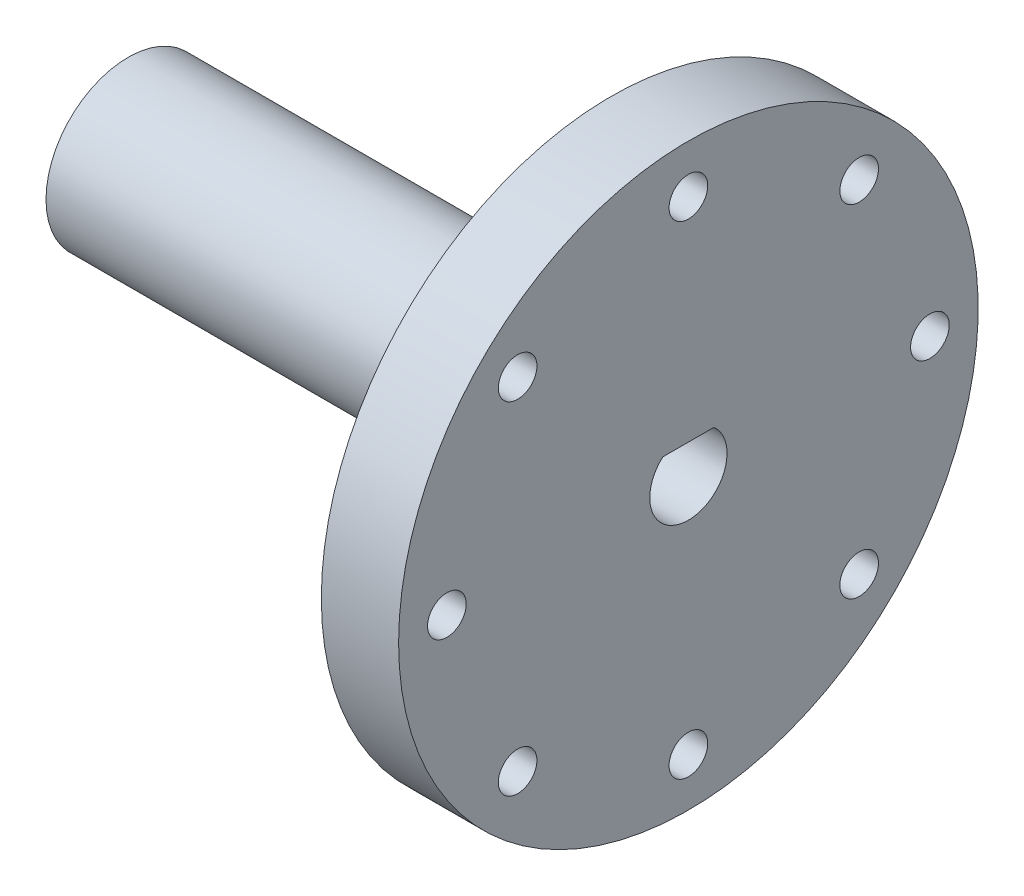
ISO-10303-21;
HEADER;
FILE_DESCRIPTION(('STEP AP214'),'2;1');
FILE_NAME('part.step','',(''),(''),'','','');
FILE_SCHEMA(('AUTOMOTIVE_DESIGN { 1 0 10303 214 1 1 1 1 }'));
ENDSEC;
DATA;
#1=APPLICATION_CONTEXT('core data for automotive mechanical design processes');
#2=APPLICATION_PROTOCOL_DEFINITION('international standard','automotive_design',2000,#1);
#3=PRODUCT_CONTEXT('',#1,'mechanical');
#4=PRODUCT('Part','Part','',(#3));
#5=PRODUCT_RELATED_PRODUCT_CATEGORY('part','',(#4));
#6=PRODUCT_DEFINITION_FORMATION('','',#4);
#7=PRODUCT_DEFINITION_CONTEXT('part definition',#1,'design');
#8=PRODUCT_DEFINITION('design','',#6,#7);
#9=PRODUCT_DEFINITION_SHAPE('','',#8);
#10=(LENGTH_UNIT() NAMED_UNIT(*) SI_UNIT(.MILLI.,.METRE.));
#11=(NAMED_UNIT(*) PLANE_ANGLE_UNIT() SI_UNIT($,.RADIAN.));
#12=(NAMED_UNIT(*) SI_UNIT($,.STERADIAN.) SOLID_ANGLE_UNIT());
#13=UNCERTAINTY_MEASURE_WITH_UNIT(LENGTH_MEASURE(1.E-05),#10,'distance_accuracy_value','');
#14=(GEOMETRIC_REPRESENTATION_CONTEXT(3) GLOBAL_UNCERTAINTY_ASSIGNED_CONTEXT((#13)) GLOBAL_UNIT_ASSIGNED_CONTEXT((#10,
#11,#12)) REPRESENTATION_CONTEXT('',''));
#15=CARTESIAN_POINT('',(0.,0.,0.));
#16=DIRECTION('',(0.,0.,1.));
#17=DIRECTION('',(1.,0.,0.));
#18=AXIS2_PLACEMENT_3D('',#15,#16,#17);
#19=CARTESIAN_POINT('',(0.,8.5,0.));
#20=DIRECTION('',(1.,0.,0.));
#21=DIRECTION('',(0.,0.,-1.));
#22=AXIS2_PLACEMENT_3D('',#19,#20,#21);
#23=PLANE('',#22);
#24=CARTESIAN_POINT('',(0.,0.,0.));
#25=DIRECTION('',(-1.,0.,0.));
#26=DIRECTION('',(0.,0.,1.));
#27=AXIS2_PLACEMENT_3D('',#24,#25,#26);
#28=CIRCLE('',#27,4.);
#29=CARTESIAN_POINT('',(0.,3.,-2.64575131106459));
#30=VERTEX_POINT('',#29);
#31=CARTESIAN_POINT('',(0.,3.,2.64575131106459));
#32=VERTEX_POINT('',#31);
#33=EDGE_CURVE('E51',#30,#32,#28,.T.);
#34=ORIENTED_EDGE('',*,*,#33,.F.);
#35=DIRECTION('',(0.,0.,1.));
#36=VECTOR('',#35,1.);
#37=CARTESIAN_POINT('',(0.,3.,-2.64575131106459));
#38=LINE('',#37,#36);
#39=EDGE_CURVE('E79',#30,#32,#38,.T.);
#40=ORIENTED_EDGE('',*,*,#39,.T.);
#41=EDGE_LOOP('',(#34,#40));
#42=FACE_BOUND('',#41,.T.);
#43=CARTESIAN_POINT('',(0.,0.,0.));
#44=DIRECTION('',(-1.,0.,0.));
#45=DIRECTION('',(0.,0.,1.));
#46=AXIS2_PLACEMENT_3D('',#43,#44,#45);
#47=CIRCLE('',#46,8.5);
#48=CARTESIAN_POINT('',(0.,0.,8.5));
#49=VERTEX_POINT('',#48);
#50=EDGE_CURVE('E98',#49,#49,#47,.T.);
#51=ORIENTED_EDGE('',*,*,#50,.T.);
#52=EDGE_LOOP('',(#51));
#53=FACE_BOUND('',#52,.T.);
#54=ADVANCED_FACE('F43',(#42,#53),#23,.F.);
#55=CARTESIAN_POINT('',(0.,0.,0.));
#56=DIRECTION('',(-1.,0.,0.));
#57=DIRECTION('',(0.,0.,1.));
#58=AXIS2_PLACEMENT_3D('',#55,#56,#57);
#59=CYLINDRICAL_SURFACE('',#58,4.);
#60=ORIENTED_EDGE('',*,*,#33,.T.);
#61=DIRECTION('',(-1.,0.,0.));
#62=VECTOR('',#61,1.);
#63=CARTESIAN_POINT('',(58.,3.,2.64575131106459));
#64=LINE('',#63,#62);
#65=CARTESIAN_POINT('',(58.,3.,2.64575131106459));
#66=VERTEX_POINT('',#65);
#67=EDGE_CURVE('E76',#66,#32,#64,.T.);
#68=ORIENTED_EDGE('',*,*,#67,.F.);
#69=CARTESIAN_POINT('',(58.,0.,0.));
#70=DIRECTION('',(-1.,0.,0.));
#71=DIRECTION('',(0.,0.,1.));
#72=AXIS2_PLACEMENT_3D('',#69,#70,#71);
#73=CIRCLE('',#72,4.);
#74=CARTESIAN_POINT('',(58.,3.,-2.64575131106459));
#75=VERTEX_POINT('',#74);
#76=EDGE_CURVE('E74',#75,#66,#73,.T.);
#77=ORIENTED_EDGE('',*,*,#76,.F.);
#78=DIRECTION('',(-1.,0.,0.));
#79=VECTOR('',#78,1.);
#80=CARTESIAN_POINT('',(58.,3.,-2.64575131106459));
#81=LINE('',#80,#79);
#82=EDGE_CURVE('E70',#75,#30,#81,.T.);
#83=ORIENTED_EDGE('',*,*,#82,.T.);
#84=EDGE_LOOP('',(#60,#68,#77,#83));
#85=FACE_BOUND('',#84,.T.);
#86=ADVANCED_FACE('F72',(#85),#59,.F.);
#87=CARTESIAN_POINT('',(58.,4.,0.));
#88=DIRECTION('',(-1.,0.,0.));
#89=DIRECTION('',(0.,0.,1.));
#90=AXIS2_PLACEMENT_3D('',#87,#88,#89);
#91=PLANE('',#90);
#92=CARTESIAN_POINT('',(58.,25.,0.));
#93=DIRECTION('',(-1.,0.,0.));
#94=DIRECTION('',(0.,0.,1.));
#95=AXIS2_PLACEMENT_3D('',#92,#93,#94);
#96=CIRCLE('',#95,2.);
#97=CARTESIAN_POINT('',(58.,25.,2.));
#98=VERTEX_POINT('',#97);
#99=EDGE_CURVE('E102',#98,#98,#96,.T.);
#100=ORIENTED_EDGE('',*,*,#99,.T.);
#101=EDGE_LOOP('',(#100));
#102=FACE_BOUND('',#101,.T.);
#103=CARTESIAN_POINT('',(58.,17.6776695296637,17.6776695296637));
#104=DIRECTION('',(-1.,0.,0.));
#105=DIRECTION('',(0.,0.,1.));
#106=AXIS2_PLACEMENT_3D('',#103,#104,#105);
#107=CIRCLE('',#106,2.00000000000001);
#108=CARTESIAN_POINT('',(58.,17.6776695296637,19.6776695296637));
#109=VERTEX_POINT('',#108);
#110=EDGE_CURVE('E106',#109,#109,#107,.T.);
#111=ORIENTED_EDGE('',*,*,#110,.T.);
#112=EDGE_LOOP('',(#111));
#113=FACE_BOUND('',#112,.T.);
#114=CARTESIAN_POINT('',(58.,0.,25.));
#115=DIRECTION('',(-1.,0.,0.));
#116=DIRECTION('',(0.,0.,1.));
#117=AXIS2_PLACEMENT_3D('',#114,#115,#116);
#118=CIRCLE('',#117,2.);
#119=CARTESIAN_POINT('',(58.,0.,27.));
#120=VERTEX_POINT('',#119);
#121=EDGE_CURVE('E110',#120,#120,#118,.T.);
#122=ORIENTED_EDGE('',*,*,#121,.T.);
#123=EDGE_LOOP('',(#122));
#124=FACE_BOUND('',#123,.T.);
#125=CARTESIAN_POINT('',(58.,-17.6776695296637,17.6776695296637));
#126=DIRECTION('',(-1.,0.,0.));
#127=DIRECTION('',(0.,0.,1.));
#128=AXIS2_PLACEMENT_3D('',#125,#126,#127);
#129=CIRCLE('',#128,2.);
#130=CARTESIAN_POINT('',(58.,-17.6776695296637,19.6776695296637));
#131=VERTEX_POINT('',#130);
#132=EDGE_CURVE('E114',#131,#131,#129,.T.);
#133=ORIENTED_EDGE('',*,*,#132,.T.);
#134=EDGE_LOOP('',(#133));
#135=FACE_BOUND('',#134,.T.);
#136=CARTESIAN_POINT('',(58.,-25.,0.));
#137=DIRECTION('',(-1.,0.,0.));
#138=DIRECTION('',(0.,0.,1.));
#139=AXIS2_PLACEMENT_3D('',#136,#137,#138);
#140=CIRCLE('',#139,2.);
#141=CARTESIAN_POINT('',(58.,-25.,2.));
#142=VERTEX_POINT('',#141);
#143=EDGE_CURVE('E118',#142,#142,#140,.T.);
#144=ORIENTED_EDGE('',*,*,#143,.T.);
#145=EDGE_LOOP('',(#144));
#146=FACE_BOUND('',#145,.T.);
#147=CARTESIAN_POINT('',(58.,-17.6776695296637,-17.6776695296637));
#148=DIRECTION('',(-1.,0.,0.));
#149=DIRECTION('',(0.,0.,1.));
#150=AXIS2_PLACEMENT_3D('',#147,#148,#149);
#151=CIRCLE('',#150,2.);
#152=CARTESIAN_POINT('',(58.,-17.6776695296637,-15.6776695296637));
#153=VERTEX_POINT('',#152);
#154=EDGE_CURVE('E122',#153,#153,#151,.T.);
#155=ORIENTED_EDGE('',*,*,#154,.T.);
#156=EDGE_LOOP('',(#155));
#157=FACE_BOUND('',#156,.T.);
#158=CARTESIAN_POINT('',(58.,0.,-25.));
#159=DIRECTION('',(-1.,0.,0.));
#160=DIRECTION('',(0.,0.,1.));
#161=AXIS2_PLACEMENT_3D('',#158,#159,#160);
#162=CIRCLE('',#161,2.);
#163=CARTESIAN_POINT('',(58.,0.,-23.));
#164=VERTEX_POINT('',#163);
#165=EDGE_CURVE('E126',#164,#164,#162,.T.);
#166=ORIENTED_EDGE('',*,*,#165,.T.);
#167=EDGE_LOOP('',(#166));
#168=FACE_BOUND('',#167,.T.);
#169=CARTESIAN_POINT('',(58.,17.6776695296637,-17.6776695296637));
#170=DIRECTION('',(-1.,0.,0.));
#171=DIRECTION('',(0.,0.,1.));
#172=AXIS2_PLACEMENT_3D('',#169,#170,#171);
#173=CIRCLE('',#172,2.);
#174=CARTESIAN_POINT('',(58.,17.6776695296637,-15.6776695296637));
#175=VERTEX_POINT('',#174);
#176=EDGE_CURVE('E130',#175,#175,#173,.T.);
#177=ORIENTED_EDGE('',*,*,#176,.T.);
#178=EDGE_LOOP('',(#177));
#179=FACE_BOUND('',#178,.T.);
#180=CARTESIAN_POINT('',(58.,0.,0.));
#181=DIRECTION('',(-1.,0.,0.));
#182=DIRECTION('',(0.,0.,1.));
#183=AXIS2_PLACEMENT_3D('',#180,#181,#182);
#184=CIRCLE('',#183,30.);
#185=CARTESIAN_POINT('',(58.,0.,30.));
#186=VERTEX_POINT('',#185);
#187=EDGE_CURVE('E88',#186,#186,#184,.T.);
#188=ORIENTED_EDGE('',*,*,#187,.F.);
#189=EDGE_LOOP('',(#188));
#190=FACE_BOUND('',#189,.T.);
#191=ORIENTED_EDGE('',*,*,#76,.T.);
#192=DIRECTION('',(0.,0.,1.));
#193=VECTOR('',#192,1.);
#194=CARTESIAN_POINT('',(58.,3.,-2.64575131106459));
#195=LINE('',#194,#193);
#196=EDGE_CURVE('E57',#75,#66,#195,.T.);
#197=ORIENTED_EDGE('',*,*,#196,.F.);
#198=EDGE_LOOP('',(#191,#197));
#199=FACE_BOUND('',#198,.T.);
#200=ADVANCED_FACE('F213',(#102,#113,#124,#135,#146,#157,#168,#179,#190,#199),#91,.F.);
#201=CARTESIAN_POINT('',(0.,0.,0.));
#202=DIRECTION('',(-1.,0.,0.));
#203=DIRECTION('',(0.,0.,1.));
#204=AXIS2_PLACEMENT_3D('',#201,#202,#203);
#205=CYLINDRICAL_SURFACE('',#204,30.);
#206=CARTESIAN_POINT('',(50.,0.,0.));
#207=DIRECTION('',(-1.,0.,0.));
#208=DIRECTION('',(0.,0.,1.));
#209=AXIS2_PLACEMENT_3D('',#206,#207,#208);
#210=CIRCLE('',#209,30.);
#211=CARTESIAN_POINT('',(50.,0.,30.));
#212=VERTEX_POINT('',#211);
#213=EDGE_CURVE('E94',#212,#212,#210,.T.);
#214=ORIENTED_EDGE('',*,*,#213,.F.);
#215=EDGE_LOOP('',(#214));
#216=FACE_BOUND('',#215,.T.);
#217=ORIENTED_EDGE('',*,*,#187,.T.);
#218=EDGE_LOOP('',(#217));
#219=FACE_BOUND('',#218,.T.);
#220=ADVANCED_FACE('F191',(#216,#219),#205,.T.);
#221=CARTESIAN_POINT('',(50.,30.,0.));
#222=DIRECTION('',(1.,0.,0.));
#223=DIRECTION('',(0.,0.,-1.));
#224=AXIS2_PLACEMENT_3D('',#221,#222,#223);
#225=PLANE('',#224);
#226=CARTESIAN_POINT('',(50.,0.,0.));
#227=DIRECTION('',(1.,0.,0.));
#228=DIRECTION('',(0.,0.,-1.));
#229=AXIS2_PLACEMENT_3D('',#226,#227,#228);
#230=CIRCLE('',#229,10.);
#231=CARTESIAN_POINT('',(50.,0.,-10.));
#232=VERTEX_POINT('',#231);
#233=EDGE_CURVE('E11',#232,#232,#230,.F.);
#234=ORIENTED_EDGE('',*,*,#233,.F.);
#235=EDGE_LOOP('',(#234));
#236=FACE_BOUND('',#235,.T.);
#237=CARTESIAN_POINT('',(50.,25.,0.));
#238=DIRECTION('',(-1.,0.,0.));
#239=DIRECTION('',(0.,0.,1.));
#240=AXIS2_PLACEMENT_3D('',#237,#238,#239);
#241=CIRCLE('',#240,2.);
#242=CARTESIAN_POINT('',(50.,25.,2.));
#243=VERTEX_POINT('',#242);
#244=EDGE_CURVE('E134',#243,#243,#241,.T.);
#245=ORIENTED_EDGE('',*,*,#244,.F.);
#246=EDGE_LOOP('',(#245));
#247=FACE_BOUND('',#246,.T.);
#248=CARTESIAN_POINT('',(50.,17.6776695296637,17.6776695296637));
#249=DIRECTION('',(-1.,0.,0.));
#250=DIRECTION('',(0.,0.,1.));
#251=AXIS2_PLACEMENT_3D('',#248,#249,#250);
#252=CIRCLE('',#251,2.00000000000001);
#253=CARTESIAN_POINT('',(50.,17.6776695296637,19.6776695296637));
#254=VERTEX_POINT('',#253);
#255=EDGE_CURVE('E159',#254,#254,#252,.T.);
#256=ORIENTED_EDGE('',*,*,#255,.F.);
#257=EDGE_LOOP('',(#256));
#258=FACE_BOUND('',#257,.T.);
#259=CARTESIAN_POINT('',(50.,0.,25.));
#260=DIRECTION('',(-1.,0.,0.));
#261=DIRECTION('',(0.,0.,1.));
#262=AXIS2_PLACEMENT_3D('',#259,#260,#261);
#263=CIRCLE('',#262,2.);
#264=CARTESIAN_POINT('',(50.,0.,27.));
#265=VERTEX_POINT('',#264);
#266=EDGE_CURVE('E155',#265,#265,#263,.T.);
#267=ORIENTED_EDGE('',*,*,#266,.F.);
#268=EDGE_LOOP('',(#267));
#269=FACE_BOUND('',#268,.T.);
#270=CARTESIAN_POINT('',(50.,-17.6776695296637,17.6776695296637));
#271=DIRECTION('',(-1.,0.,0.));
#272=DIRECTION('',(0.,0.,1.));
#273=AXIS2_PLACEMENT_3D('',#270,#271,#272);
#274=CIRCLE('',#273,2.);
#275=CARTESIAN_POINT('',(50.,-17.6776695296637,19.6776695296637));
#276=VERTEX_POINT('',#275);
#277=EDGE_CURVE('E151',#276,#276,#274,.T.);
#278=ORIENTED_EDGE('',*,*,#277,.F.);
#279=EDGE_LOOP('',(#278));
#280=FACE_BOUND('',#279,.T.);
#281=CARTESIAN_POINT('',(50.,-25.,0.));
#282=DIRECTION('',(-1.,0.,0.));
#283=DIRECTION('',(0.,0.,1.));
#284=AXIS2_PLACEMENT_3D('',#281,#282,#283);
#285=CIRCLE('',#284,2.);
#286=CARTESIAN_POINT('',(50.,-25.,2.));
#287=VERTEX_POINT('',#286);
#288=EDGE_CURVE('E147',#287,#287,#285,.T.);
#289=ORIENTED_EDGE('',*,*,#288,.F.);
#290=EDGE_LOOP('',(#289));
#291=FACE_BOUND('',#290,.T.);
#292=CARTESIAN_POINT('',(50.,-17.6776695296637,-17.6776695296637));
#293=DIRECTION('',(-1.,0.,0.));
#294=DIRECTION('',(0.,0.,1.));
#295=AXIS2_PLACEMENT_3D('',#292,#293,#294);
#296=CIRCLE('',#295,2.);
#297=CARTESIAN_POINT('',(50.,-17.6776695296637,-15.6776695296637));
#298=VERTEX_POINT('',#297);
#299=EDGE_CURVE('E143',#298,#298,#296,.T.);
#300=ORIENTED_EDGE('',*,*,#299,.F.);
#301=EDGE_LOOP('',(#300));
#302=FACE_BOUND('',#301,.T.);
#303=CARTESIAN_POINT('',(50.,0.,-25.));
#304=DIRECTION('',(-1.,0.,0.));
#305=DIRECTION('',(0.,0.,1.));
#306=AXIS2_PLACEMENT_3D('',#303,#304,#305);
#307=CIRCLE('',#306,2.);
#308=CARTESIAN_POINT('',(50.,0.,-23.));
#309=VERTEX_POINT('',#308);
#310=EDGE_CURVE('E139',#309,#309,#307,.T.);
#311=ORIENTED_EDGE('',*,*,#310,.F.);
#312=EDGE_LOOP('',(#311));
#313=FACE_BOUND('',#312,.T.);
#314=CARTESIAN_POINT('',(50.,17.6776695296637,-17.6776695296637));
#315=DIRECTION('',(-1.,0.,0.));
#316=DIRECTION('',(0.,0.,1.));
#317=AXIS2_PLACEMENT_3D('',#314,#315,#316);
#318=CIRCLE('',#317,2.);
#319=CARTESIAN_POINT('',(50.,17.6776695296637,-15.6776695296637));
#320=VERTEX_POINT('',#319);
#321=EDGE_CURVE('E135',#320,#320,#318,.T.);
#322=ORIENTED_EDGE('',*,*,#321,.F.);
#323=EDGE_LOOP('',(#322));
#324=FACE_BOUND('',#323,.T.);
#325=ORIENTED_EDGE('',*,*,#213,.T.);
#326=EDGE_LOOP('',(#325));
#327=FACE_BOUND('',#326,.T.);
#328=ADVANCED_FACE('F187',(#236,#247,#258,#269,#280,#291,#302,#313,#324,#327),#225,.F.);
#329=CARTESIAN_POINT('',(0.,0.,0.));
#330=DIRECTION('',(-1.,0.,0.));
#331=DIRECTION('',(0.,0.,1.));
#332=AXIS2_PLACEMENT_3D('',#329,#330,#331);
#333=CYLINDRICAL_SURFACE('',#332,8.5);
#334=CARTESIAN_POINT('',(39.,0.,0.));
#335=DIRECTION('',(-1.,0.,0.));
#336=DIRECTION('',(0.,0.,1.));
#337=AXIS2_PLACEMENT_3D('',#334,#335,#336);
#338=CIRCLE('',#337,8.5);
#339=CARTESIAN_POINT('',(39.,0.,8.5));
#340=VERTEX_POINT('',#339);
#341=EDGE_CURVE('E83',#340,#340,#338,.T.);
#342=ORIENTED_EDGE('',*,*,#341,.T.);
#343=EDGE_LOOP('',(#342));
#344=FACE_BOUND('',#343,.T.);
#345=ORIENTED_EDGE('',*,*,#50,.F.);
#346=EDGE_LOOP('',(#345));
#347=FACE_BOUND('',#346,.T.);
#348=ADVANCED_FACE('F190',(#344,#347),#333,.T.);
#349=CARTESIAN_POINT('',(60.,17.6776695296637,-17.6776695296637));
#350=DIRECTION('',(-1.,0.,0.));
#351=DIRECTION('',(0.,0.,1.));
#352=AXIS2_PLACEMENT_3D('',#349,#350,#351);
#353=CYLINDRICAL_SURFACE('',#352,2.);
#354=ORIENTED_EDGE('',*,*,#321,.T.);
#355=EDGE_LOOP('',(#354));
#356=FACE_BOUND('',#355,.T.);
#357=ORIENTED_EDGE('',*,*,#176,.F.);
#358=EDGE_LOOP('',(#357));
#359=FACE_BOUND('',#358,.T.);
#360=ADVANCED_FACE('F254',(#356,#359),#353,.F.);
#361=CARTESIAN_POINT('',(60.,0.,-25.));
#362=DIRECTION('',(-1.,0.,0.));
#363=DIRECTION('',(0.,0.,1.));
#364=AXIS2_PLACEMENT_3D('',#361,#362,#363);
#365=CYLINDRICAL_SURFACE('',#364,2.);
#366=ORIENTED_EDGE('',*,*,#310,.T.);
#367=EDGE_LOOP('',(#366));
#368=FACE_BOUND('',#367,.T.);
#369=ORIENTED_EDGE('',*,*,#165,.F.);
#370=EDGE_LOOP('',(#369));
#371=FACE_BOUND('',#370,.T.);
#372=ADVANCED_FACE('F345',(#368,#371),#365,.F.);
#373=CARTESIAN_POINT('',(60.,-17.6776695296637,-17.6776695296637));
#374=DIRECTION('',(-1.,0.,0.));
#375=DIRECTION('',(0.,0.,1.));
#376=AXIS2_PLACEMENT_3D('',#373,#374,#375);
#377=CYLINDRICAL_SURFACE('',#376,2.);
#378=ORIENTED_EDGE('',*,*,#299,.T.);
#379=EDGE_LOOP('',(#378));
#380=FACE_BOUND('',#379,.T.);
#381=ORIENTED_EDGE('',*,*,#154,.F.);
#382=EDGE_LOOP('',(#381));
#383=FACE_BOUND('',#382,.T.);
#384=ADVANCED_FACE('F335',(#380,#383),#377,.F.);
#385=CARTESIAN_POINT('',(60.,-25.,0.));
#386=DIRECTION('',(-1.,0.,0.));
#387=DIRECTION('',(0.,0.,1.));
#388=AXIS2_PLACEMENT_3D('',#385,#386,#387);
#389=CYLINDRICAL_SURFACE('',#388,2.);
#390=ORIENTED_EDGE('',*,*,#288,.T.);
#391=EDGE_LOOP('',(#390));
#392=FACE_BOUND('',#391,.T.);
#393=ORIENTED_EDGE('',*,*,#143,.F.);
#394=EDGE_LOOP('',(#393));
#395=FACE_BOUND('',#394,.T.);
#396=ADVANCED_FACE('F325',(#392,#395),#389,.F.);
#397=CARTESIAN_POINT('',(60.,-17.6776695296637,17.6776695296637));
#398=DIRECTION('',(-1.,0.,0.));
#399=DIRECTION('',(0.,0.,1.));
#400=AXIS2_PLACEMENT_3D('',#397,#398,#399);
#401=CYLINDRICAL_SURFACE('',#400,2.);
#402=ORIENTED_EDGE('',*,*,#277,.T.);
#403=EDGE_LOOP('',(#402));
#404=FACE_BOUND('',#403,.T.);
#405=ORIENTED_EDGE('',*,*,#132,.F.);
#406=EDGE_LOOP('',(#405));
#407=FACE_BOUND('',#406,.T.);
#408=ADVANCED_FACE('F315',(#404,#407),#401,.F.);
#409=CARTESIAN_POINT('',(60.,0.,25.));
#410=DIRECTION('',(-1.,0.,0.));
#411=DIRECTION('',(0.,0.,1.));
#412=AXIS2_PLACEMENT_3D('',#409,#410,#411);
#413=CYLINDRICAL_SURFACE('',#412,2.);
#414=ORIENTED_EDGE('',*,*,#266,.T.);
#415=EDGE_LOOP('',(#414));
#416=FACE_BOUND('',#415,.T.);
#417=ORIENTED_EDGE('',*,*,#121,.F.);
#418=EDGE_LOOP('',(#417));
#419=FACE_BOUND('',#418,.T.);
#420=ADVANCED_FACE('F305',(#416,#419),#413,.F.);
#421=CARTESIAN_POINT('',(60.,17.6776695296637,17.6776695296637));
#422=DIRECTION('',(-1.,0.,0.));
#423=DIRECTION('',(0.,0.,1.));
#424=AXIS2_PLACEMENT_3D('',#421,#422,#423);
#425=CYLINDRICAL_SURFACE('',#424,2.00000000000001);
#426=ORIENTED_EDGE('',*,*,#255,.T.);
#427=EDGE_LOOP('',(#426));
#428=FACE_BOUND('',#427,.T.);
#429=ORIENTED_EDGE('',*,*,#110,.F.);
#430=EDGE_LOOP('',(#429));
#431=FACE_BOUND('',#430,.T.);
#432=ADVANCED_FACE('F296',(#428,#431),#425,.F.);
#433=CARTESIAN_POINT('',(60.,25.,0.));
#434=DIRECTION('',(-1.,0.,0.));
#435=DIRECTION('',(0.,0.,1.));
#436=AXIS2_PLACEMENT_3D('',#433,#434,#435);
#437=CYLINDRICAL_SURFACE('',#436,2.);
#438=ORIENTED_EDGE('',*,*,#244,.T.);
#439=EDGE_LOOP('',(#438));
#440=FACE_BOUND('',#439,.T.);
#441=ORIENTED_EDGE('',*,*,#99,.F.);
#442=EDGE_LOOP('',(#441));
#443=FACE_BOUND('',#442,.T.);
#444=ADVANCED_FACE('F267',(#440,#443),#437,.F.);
#445=CARTESIAN_POINT('',(58.,3.,-2.64575131106459));
#446=DIRECTION('',(0.,-1.,0.));
#447=DIRECTION('',(0.,0.,-1.));
#448=AXIS2_PLACEMENT_3D('',#445,#446,#447);
#449=PLANE('',#448);
#450=ORIENTED_EDGE('',*,*,#39,.F.);
#451=ORIENTED_EDGE('',*,*,#82,.F.);
#452=ORIENTED_EDGE('',*,*,#196,.T.);
#453=ORIENTED_EDGE('',*,*,#67,.T.);
#454=EDGE_LOOP('',(#450,#451,#452,#453));
#455=FACE_BOUND('',#454,.T.);
#456=ADVANCED_FACE('F80',(#455),#449,.T.);
#457=CARTESIAN_POINT('',(39.,0.,0.));
#458=DIRECTION('',(-1.,0.,0.));
#459=DIRECTION('',(0.,0.,1.));
#460=AXIS2_PLACEMENT_3D('',#457,#458,#459);
#461=PLANE('',#460);
#462=CARTESIAN_POINT('',(39.,0.,0.));
#463=DIRECTION('',(-1.,0.,0.));
#464=DIRECTION('',(0.,0.,1.));
#465=AXIS2_PLACEMENT_3D('',#462,#463,#464);
#466=CIRCLE('',#465,10.);
#467=CARTESIAN_POINT('',(39.,0.,10.));
#468=VERTEX_POINT('',#467);
#469=EDGE_CURVE('E173',#468,#468,#466,.T.);
#470=ORIENTED_EDGE('',*,*,#469,.T.);
#471=EDGE_LOOP('',(#470));
#472=FACE_BOUND('',#471,.T.);
#473=ORIENTED_EDGE('',*,*,#341,.F.);
#474=EDGE_LOOP('',(#473));
#475=FACE_BOUND('',#474,.T.);
#476=ADVANCED_FACE('F178',(#472,#475),#461,.T.);
#477=CARTESIAN_POINT('',(39.,0.,0.));
#478=DIRECTION('',(1.,0.,0.));
#479=DIRECTION('',(0.,0.,-1.));
#480=AXIS2_PLACEMENT_3D('',#477,#478,#479);
#481=CYLINDRICAL_SURFACE('',#480,10.);
#482=ORIENTED_EDGE('',*,*,#469,.F.);
#483=EDGE_LOOP('',(#482));
#484=FACE_BOUND('',#483,.T.);
#485=ORIENTED_EDGE('',*,*,#233,.T.);
#486=EDGE_LOOP('',(#485));
#487=FACE_BOUND('',#486,.T.);
#488=ADVANCED_FACE('F181',(#484,#487),#481,.T.);
#489=CLOSED_SHELL('',(#54,#86,#200,#220,#328,#348,#360,#372,#384,#396,#408,#420,#432,#444,#456,
#476,#488));
#490=MANIFOLD_SOLID_BREP('B2',#489);
#491=ADVANCED_BREP_SHAPE_REPRESENTATION('',(#18,#490),#14);
#492=SHAPE_DEFINITION_REPRESENTATION(#9,#491);
ENDSEC;
END-ISO-10303-21;
